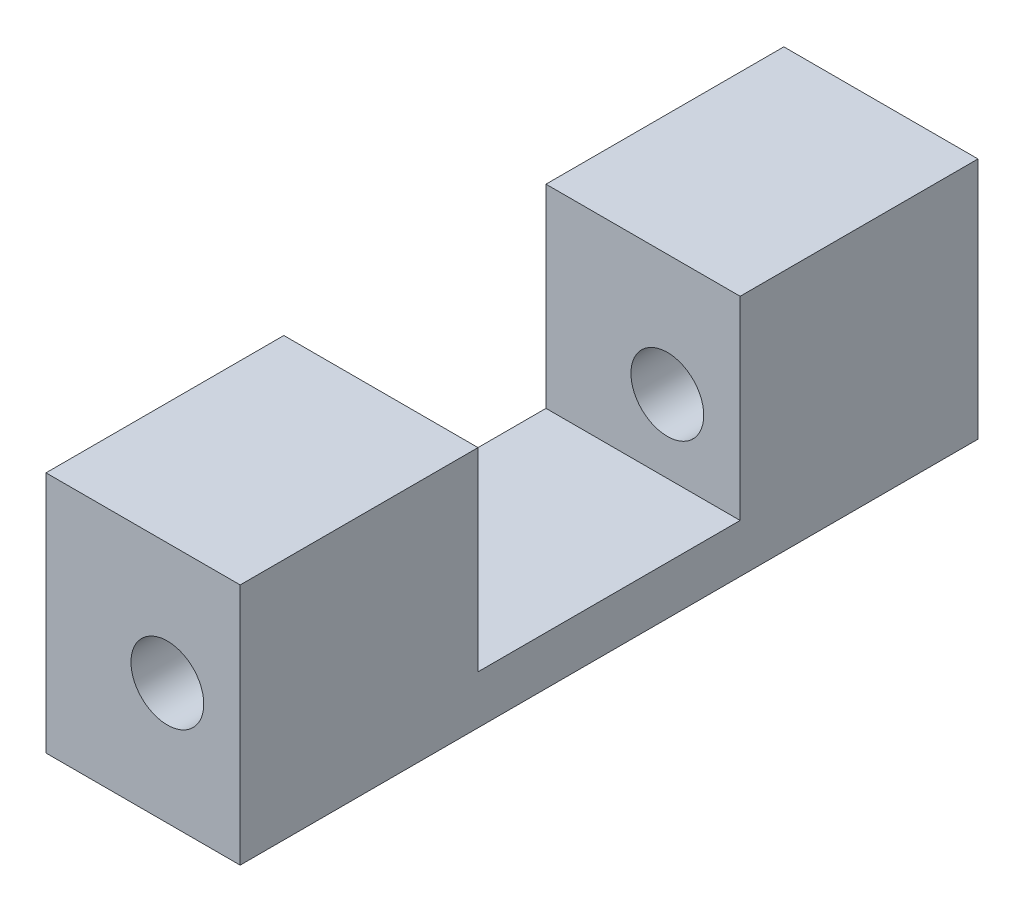
ISO-10303-21;
HEADER;
FILE_DESCRIPTION(('STEP AP214'),'2;1');
FILE_NAME('part.step','',(''),(''),'','','');
FILE_SCHEMA(('AUTOMOTIVE_DESIGN { 1 0 10303 214 1 1 1 1 }'));
ENDSEC;
DATA;
#1=APPLICATION_CONTEXT('core data for automotive mechanical design processes');
#2=APPLICATION_PROTOCOL_DEFINITION('international standard','automotive_design',2000,#1);
#3=PRODUCT_CONTEXT('',#1,'mechanical');
#4=PRODUCT('Part','Part','',(#3));
#5=PRODUCT_RELATED_PRODUCT_CATEGORY('part','',(#4));
#6=PRODUCT_DEFINITION_FORMATION('','',#4);
#7=PRODUCT_DEFINITION_CONTEXT('part definition',#1,'design');
#8=PRODUCT_DEFINITION('design','',#6,#7);
#9=PRODUCT_DEFINITION_SHAPE('','',#8);
#10=(LENGTH_UNIT() NAMED_UNIT(*) SI_UNIT(.MILLI.,.METRE.));
#11=(NAMED_UNIT(*) PLANE_ANGLE_UNIT() SI_UNIT($,.RADIAN.));
#12=(NAMED_UNIT(*) SI_UNIT($,.STERADIAN.) SOLID_ANGLE_UNIT());
#13=UNCERTAINTY_MEASURE_WITH_UNIT(LENGTH_MEASURE(1.E-05),#10,'distance_accuracy_value','');
#14=(GEOMETRIC_REPRESENTATION_CONTEXT(3) GLOBAL_UNCERTAINTY_ASSIGNED_CONTEXT((#13)) GLOBAL_UNIT_ASSIGNED_CONTEXT((#10,
#11,#12)) REPRESENTATION_CONTEXT('',''));
#15=CARTESIAN_POINT('',(0.,0.,0.));
#16=DIRECTION('',(0.,0.,1.));
#17=DIRECTION('',(1.,0.,0.));
#18=AXIS2_PLACEMENT_3D('',#15,#16,#17);
#19=CARTESIAN_POINT('',(-2.,1.,-7.6));
#20=DIRECTION('',(0.,0.,1.));
#21=DIRECTION('',(1.,0.,0.));
#22=AXIS2_PLACEMENT_3D('',#19,#20,#21);
#23=PLANE('',#22);
#24=DIRECTION('',(-1.,0.,0.));
#25=VECTOR('',#24,1.);
#26=CARTESIAN_POINT('',(-2.,0.,-7.6));
#27=LINE('',#26,#25);
#28=CARTESIAN_POINT('',(2.,0.,-7.6));
#29=VERTEX_POINT('',#28);
#30=CARTESIAN_POINT('',(-2.,0.,-7.6));
#31=VERTEX_POINT('',#30);
#32=EDGE_CURVE('E171',#29,#31,#27,.T.);
#33=ORIENTED_EDGE('',*,*,#32,.T.);
#34=DIRECTION('',(0.,-1.,0.));
#35=VECTOR('',#34,1.);
#36=CARTESIAN_POINT('',(-2.,1.,-7.6));
#37=LINE('',#36,#35);
#38=CARTESIAN_POINT('',(-2.,5.,-7.6));
#39=VERTEX_POINT('',#38);
#40=EDGE_CURVE('E47',#39,#31,#37,.T.);
#41=ORIENTED_EDGE('',*,*,#40,.F.);
#42=DIRECTION('',(1.,0.,0.));
#43=VECTOR('',#42,1.);
#44=CARTESIAN_POINT('',(-2.,5.,-7.6));
#45=LINE('',#44,#43);
#46=CARTESIAN_POINT('',(2.,5.,-7.6));
#47=VERTEX_POINT('',#46);
#48=EDGE_CURVE('E124',#39,#47,#45,.T.);
#49=ORIENTED_EDGE('',*,*,#48,.T.);
#50=DIRECTION('',(0.,-1.,0.));
#51=VECTOR('',#50,1.);
#52=CARTESIAN_POINT('',(2.,1.,-7.6));
#53=LINE('',#52,#51);
#54=EDGE_CURVE('E11',#47,#29,#53,.T.);
#55=ORIENTED_EDGE('',*,*,#54,.T.);
#56=EDGE_LOOP('',(#33,#41,#49,#55));
#57=FACE_BOUND('',#56,.T.);
#58=CARTESIAN_POINT('',(0.5,2.5,-7.6));
#59=DIRECTION('',(0.,0.,1.));
#60=DIRECTION('',(1.,0.,0.));
#61=AXIS2_PLACEMENT_3D('',#58,#59,#60);
#62=CIRCLE('',#61,0.750000000000001);
#63=CARTESIAN_POINT('',(1.25,2.5,-7.6));
#64=VERTEX_POINT('',#63);
#65=EDGE_CURVE('E328',#64,#64,#62,.T.);
#66=ORIENTED_EDGE('',*,*,#65,.T.);
#67=EDGE_LOOP('',(#66));
#68=FACE_BOUND('',#67,.T.);
#69=ADVANCED_FACE('F37',(#57,#68),#23,.F.);
#70=CARTESIAN_POINT('',(-2.,5.,-2.7));
#71=DIRECTION('',(0.,0.,1.));
#72=DIRECTION('',(1.,0.,0.));
#73=AXIS2_PLACEMENT_3D('',#70,#71,#72);
#74=PLANE('',#73);
#75=DIRECTION('',(-1.,0.,0.));
#76=VECTOR('',#75,1.);
#77=CARTESIAN_POINT('',(-2.,1.,-2.7));
#78=LINE('',#77,#76);
#79=CARTESIAN_POINT('',(2.,1.,-2.7));
#80=VERTEX_POINT('',#79);
#81=CARTESIAN_POINT('',(-2.,1.,-2.7));
#82=VERTEX_POINT('',#81);
#83=EDGE_CURVE('E125',#80,#82,#78,.T.);
#84=ORIENTED_EDGE('',*,*,#83,.F.);
#85=DIRECTION('',(0.,-1.,0.));
#86=VECTOR('',#85,1.);
#87=CARTESIAN_POINT('',(2.,5.,-2.7));
#88=LINE('',#87,#86);
#89=CARTESIAN_POINT('',(2.,5.,-2.7));
#90=VERTEX_POINT('',#89);
#91=EDGE_CURVE('E115',#90,#80,#88,.T.);
#92=ORIENTED_EDGE('',*,*,#91,.F.);
#93=DIRECTION('',(-1.,0.,0.));
#94=VECTOR('',#93,1.);
#95=CARTESIAN_POINT('',(-2.,5.,-2.7));
#96=LINE('',#95,#94);
#97=CARTESIAN_POINT('',(-2.,5.,-2.7));
#98=VERTEX_POINT('',#97);
#99=EDGE_CURVE('E121',#90,#98,#96,.T.);
#100=ORIENTED_EDGE('',*,*,#99,.T.);
#101=DIRECTION('',(0.,-1.,0.));
#102=VECTOR('',#101,1.);
#103=CARTESIAN_POINT('',(-2.,5.,-2.7));
#104=LINE('',#103,#102);
#105=EDGE_CURVE('E104',#98,#82,#104,.T.);
#106=ORIENTED_EDGE('',*,*,#105,.T.);
#107=EDGE_LOOP('',(#84,#92,#100,#106));
#108=FACE_BOUND('',#107,.T.);
#109=CARTESIAN_POINT('',(0.5,2.5,-2.7));
#110=DIRECTION('',(0.,0.,1.));
#111=DIRECTION('',(1.,0.,0.));
#112=AXIS2_PLACEMENT_3D('',#109,#110,#111);
#113=CIRCLE('',#112,0.750000000000001);
#114=CARTESIAN_POINT('',(1.25,2.5,-2.7));
#115=VERTEX_POINT('',#114);
#116=EDGE_CURVE('E136',#115,#115,#113,.T.);
#117=ORIENTED_EDGE('',*,*,#116,.F.);
#118=EDGE_LOOP('',(#117));
#119=FACE_BOUND('',#118,.T.);
#120=ADVANCED_FACE('F127',(#108,#119),#74,.T.);
#121=CARTESIAN_POINT('',(0.,1.,0.));
#122=DIRECTION('',(0.,-1.,0.));
#123=DIRECTION('',(0.,0.,-1.));
#124=AXIS2_PLACEMENT_3D('',#121,#122,#123);
#125=PLANE('',#124);
#126=DIRECTION('',(0.,0.,-1.));
#127=VECTOR('',#126,1.);
#128=CARTESIAN_POINT('',(2.,1.,7.6));
#129=LINE('',#128,#127);
#130=CARTESIAN_POINT('',(2.,1.,2.7));
#131=VERTEX_POINT('',#130);
#132=EDGE_CURVE('E55',#131,#80,#129,.T.);
#133=ORIENTED_EDGE('',*,*,#132,.T.);
#134=ORIENTED_EDGE('',*,*,#83,.T.);
#135=DIRECTION('',(0.,0.,1.));
#136=VECTOR('',#135,1.);
#137=CARTESIAN_POINT('',(-2.,1.,7.6));
#138=LINE('',#137,#136);
#139=CARTESIAN_POINT('',(-2.,1.,2.7));
#140=VERTEX_POINT('',#139);
#141=EDGE_CURVE('E41',#82,#140,#138,.T.);
#142=ORIENTED_EDGE('',*,*,#141,.T.);
#143=DIRECTION('',(-1.,0.,0.));
#144=VECTOR('',#143,1.);
#145=CARTESIAN_POINT('',(-2.,1.,2.7));
#146=LINE('',#145,#144);
#147=EDGE_CURVE('E60',#131,#140,#146,.T.);
#148=ORIENTED_EDGE('',*,*,#147,.F.);
#149=EDGE_LOOP('',(#133,#134,#142,#148));
#150=FACE_BOUND('',#149,.T.);
#151=ADVANCED_FACE('F218',(#150),#125,.F.);
#152=CARTESIAN_POINT('',(2.,1.,7.6));
#153=DIRECTION('',(-1.,0.,0.));
#154=DIRECTION('',(0.,0.,1.));
#155=AXIS2_PLACEMENT_3D('',#152,#153,#154);
#156=PLANE('',#155);
#157=DIRECTION('',(0.,0.,-1.));
#158=VECTOR('',#157,1.);
#159=CARTESIAN_POINT('',(2.,0.,7.6));
#160=LINE('',#159,#158);
#161=CARTESIAN_POINT('',(2.,0.,7.6));
#162=VERTEX_POINT('',#161);
#163=EDGE_CURVE('E165',#162,#29,#160,.T.);
#164=ORIENTED_EDGE('',*,*,#163,.T.);
#165=ORIENTED_EDGE('',*,*,#54,.F.);
#166=DIRECTION('',(0.,0.,1.));
#167=VECTOR('',#166,1.);
#168=CARTESIAN_POINT('',(2.,5.,-7.6));
#169=LINE('',#168,#167);
#170=EDGE_CURVE('E129',#47,#90,#169,.T.);
#171=ORIENTED_EDGE('',*,*,#170,.T.);
#172=ORIENTED_EDGE('',*,*,#91,.T.);
#173=ORIENTED_EDGE('',*,*,#132,.F.);
#174=DIRECTION('',(0.,-1.,0.));
#175=VECTOR('',#174,1.);
#176=CARTESIAN_POINT('',(2.,5.,2.7));
#177=LINE('',#176,#175);
#178=CARTESIAN_POINT('',(2.,5.,2.7));
#179=VERTEX_POINT('',#178);
#180=EDGE_CURVE('E161',#179,#131,#177,.T.);
#181=ORIENTED_EDGE('',*,*,#180,.F.);
#182=DIRECTION('',(0.,0.,-1.));
#183=VECTOR('',#182,1.);
#184=CARTESIAN_POINT('',(2.,5.,7.6));
#185=LINE('',#184,#183);
#186=CARTESIAN_POINT('',(2.,5.,7.6));
#187=VERTEX_POINT('',#186);
#188=EDGE_CURVE('E149',#187,#179,#185,.T.);
#189=ORIENTED_EDGE('',*,*,#188,.F.);
#190=DIRECTION('',(0.,-1.,0.));
#191=VECTOR('',#190,1.);
#192=CARTESIAN_POINT('',(2.,1.,7.6));
#193=LINE('',#192,#191);
#194=EDGE_CURVE('E183',#187,#162,#193,.T.);
#195=ORIENTED_EDGE('',*,*,#194,.T.);
#196=EDGE_LOOP('',(#164,#165,#171,#172,#173,#181,#189,#195));
#197=FACE_BOUND('',#196,.T.);
#198=ADVANCED_FACE('F39',(#197),#156,.F.);
#199=CARTESIAN_POINT('',(-2.,1.,7.6));
#200=DIRECTION('',(1.,0.,0.));
#201=DIRECTION('',(0.,0.,-1.));
#202=AXIS2_PLACEMENT_3D('',#199,#200,#201);
#203=PLANE('',#202);
#204=DIRECTION('',(0.,0.,1.));
#205=VECTOR('',#204,1.);
#206=CARTESIAN_POINT('',(-2.,0.,7.6));
#207=LINE('',#206,#205);
#208=CARTESIAN_POINT('',(-2.,0.,7.6));
#209=VERTEX_POINT('',#208);
#210=EDGE_CURVE('E176',#31,#209,#207,.T.);
#211=ORIENTED_EDGE('',*,*,#210,.T.);
#212=DIRECTION('',(0.,-1.,0.));
#213=VECTOR('',#212,1.);
#214=CARTESIAN_POINT('',(-2.,1.,7.6));
#215=LINE('',#214,#213);
#216=CARTESIAN_POINT('',(-2.,5.,7.6));
#217=VERTEX_POINT('',#216);
#218=EDGE_CURVE('E185',#217,#209,#215,.T.);
#219=ORIENTED_EDGE('',*,*,#218,.F.);
#220=DIRECTION('',(0.,0.,1.));
#221=VECTOR('',#220,1.);
#222=CARTESIAN_POINT('',(-2.,5.,7.6));
#223=LINE('',#222,#221);
#224=CARTESIAN_POINT('',(-2.,5.,2.7));
#225=VERTEX_POINT('',#224);
#226=EDGE_CURVE('E143',#225,#217,#223,.T.);
#227=ORIENTED_EDGE('',*,*,#226,.F.);
#228=DIRECTION('',(0.,-1.,0.));
#229=VECTOR('',#228,1.);
#230=CARTESIAN_POINT('',(-2.,5.,2.7));
#231=LINE('',#230,#229);
#232=EDGE_CURVE('E153',#225,#140,#231,.T.);
#233=ORIENTED_EDGE('',*,*,#232,.T.);
#234=ORIENTED_EDGE('',*,*,#141,.F.);
#235=ORIENTED_EDGE('',*,*,#105,.F.);
#236=DIRECTION('',(0.,0.,-1.));
#237=VECTOR('',#236,1.);
#238=CARTESIAN_POINT('',(-2.,5.,-7.6));
#239=LINE('',#238,#237);
#240=EDGE_CURVE('E108',#98,#39,#239,.T.);
#241=ORIENTED_EDGE('',*,*,#240,.T.);
#242=ORIENTED_EDGE('',*,*,#40,.T.);
#243=EDGE_LOOP('',(#211,#219,#227,#233,#234,#235,#241,#242));
#244=FACE_BOUND('',#243,.T.);
#245=ADVANCED_FACE('F106',(#244),#203,.F.);
#246=CARTESIAN_POINT('',(-2.,1.,7.6));
#247=DIRECTION('',(0.,0.,-1.));
#248=DIRECTION('',(-1.,0.,0.));
#249=AXIS2_PLACEMENT_3D('',#246,#247,#248);
#250=PLANE('',#249);
#251=CARTESIAN_POINT('',(0.5,2.5,7.6));
#252=DIRECTION('',(0.,0.,1.));
#253=DIRECTION('',(1.,0.,0.));
#254=AXIS2_PLACEMENT_3D('',#251,#252,#253);
#255=CIRCLE('',#254,0.750000000000001);
#256=CARTESIAN_POINT('',(1.25,2.5,7.6));
#257=VERTEX_POINT('',#256);
#258=EDGE_CURVE('E114',#257,#257,#255,.T.);
#259=ORIENTED_EDGE('',*,*,#258,.F.);
#260=EDGE_LOOP('',(#259));
#261=FACE_BOUND('',#260,.T.);
#262=DIRECTION('',(1.,0.,0.));
#263=VECTOR('',#262,1.);
#264=CARTESIAN_POINT('',(-2.,0.,7.6));
#265=LINE('',#264,#263);
#266=EDGE_CURVE('E181',#209,#162,#265,.T.);
#267=ORIENTED_EDGE('',*,*,#266,.T.);
#268=ORIENTED_EDGE('',*,*,#194,.F.);
#269=DIRECTION('',(1.,0.,0.));
#270=VECTOR('',#269,1.);
#271=CARTESIAN_POINT('',(-2.,5.,7.6));
#272=LINE('',#271,#270);
#273=EDGE_CURVE('E146',#217,#187,#272,.T.);
#274=ORIENTED_EDGE('',*,*,#273,.F.);
#275=ORIENTED_EDGE('',*,*,#218,.T.);
#276=EDGE_LOOP('',(#267,#268,#274,#275));
#277=FACE_BOUND('',#276,.T.);
#278=ADVANCED_FACE('F194',(#261,#277),#250,.F.);
#279=CARTESIAN_POINT('',(0.,0.,0.));
#280=DIRECTION('',(0.,-1.,0.));
#281=DIRECTION('',(0.,0.,-1.));
#282=AXIS2_PLACEMENT_3D('',#279,#280,#281);
#283=PLANE('',#282);
#284=ORIENTED_EDGE('',*,*,#163,.F.);
#285=ORIENTED_EDGE('',*,*,#266,.F.);
#286=ORIENTED_EDGE('',*,*,#210,.F.);
#287=ORIENTED_EDGE('',*,*,#32,.F.);
#288=EDGE_LOOP('',(#284,#285,#286,#287));
#289=FACE_BOUND('',#288,.T.);
#290=ADVANCED_FACE('F192',(#289),#283,.T.);
#291=CARTESIAN_POINT('',(-2.,5.,2.7));
#292=DIRECTION('',(0.,0.,1.));
#293=DIRECTION('',(1.,0.,0.));
#294=AXIS2_PLACEMENT_3D('',#291,#292,#293);
#295=PLANE('',#294);
#296=CARTESIAN_POINT('',(0.5,2.5,2.7));
#297=DIRECTION('',(0.,0.,1.));
#298=DIRECTION('',(1.,0.,0.));
#299=AXIS2_PLACEMENT_3D('',#296,#297,#298);
#300=CIRCLE('',#299,0.750000000000001);
#301=CARTESIAN_POINT('',(1.25,2.5,2.7));
#302=VERTEX_POINT('',#301);
#303=EDGE_CURVE('E140',#302,#302,#300,.F.);
#304=ORIENTED_EDGE('',*,*,#303,.F.);
#305=EDGE_LOOP('',(#304));
#306=FACE_BOUND('',#305,.T.);
#307=ORIENTED_EDGE('',*,*,#147,.T.);
#308=ORIENTED_EDGE('',*,*,#232,.F.);
#309=DIRECTION('',(-1.,0.,0.));
#310=VECTOR('',#309,1.);
#311=CARTESIAN_POINT('',(-2.,5.,2.7));
#312=LINE('',#311,#310);
#313=EDGE_CURVE('E151',#179,#225,#312,.T.);
#314=ORIENTED_EDGE('',*,*,#313,.F.);
#315=ORIENTED_EDGE('',*,*,#180,.T.);
#316=EDGE_LOOP('',(#307,#308,#314,#315));
#317=FACE_BOUND('',#316,.T.);
#318=ADVANCED_FACE('F201',(#306,#317),#295,.F.);
#319=CARTESIAN_POINT('',(0.,5.,0.));
#320=DIRECTION('',(0.,-1.,0.));
#321=DIRECTION('',(0.,0.,-1.));
#322=AXIS2_PLACEMENT_3D('',#319,#320,#321);
#323=PLANE('',#322);
#324=ORIENTED_EDGE('',*,*,#226,.T.);
#325=ORIENTED_EDGE('',*,*,#273,.T.);
#326=ORIENTED_EDGE('',*,*,#188,.T.);
#327=ORIENTED_EDGE('',*,*,#313,.T.);
#328=EDGE_LOOP('',(#324,#325,#326,#327));
#329=FACE_BOUND('',#328,.T.);
#330=ADVANCED_FACE('F198',(#329),#323,.F.);
#331=CARTESIAN_POINT('',(0.5,2.5,-7.601025));
#332=DIRECTION('',(0.,0.,1.));
#333=DIRECTION('',(1.,0.,0.));
#334=AXIS2_PLACEMENT_3D('',#331,#332,#333);
#335=CYLINDRICAL_SURFACE('',#334,0.750000000000001);
#336=ORIENTED_EDGE('',*,*,#258,.T.);
#337=EDGE_LOOP('',(#336));
#338=FACE_BOUND('',#337,.T.);
#339=ORIENTED_EDGE('',*,*,#303,.T.);
#340=EDGE_LOOP('',(#339));
#341=FACE_BOUND('',#340,.T.);
#342=ADVANCED_FACE('F209',(#338,#341),#335,.F.);
#343=CARTESIAN_POINT('',(0.,5.,0.));
#344=DIRECTION('',(0.,-1.,0.));
#345=DIRECTION('',(0.,0.,1.));
#346=AXIS2_PLACEMENT_3D('',#343,#344,#345);
#347=PLANE('',#346);
#348=ORIENTED_EDGE('',*,*,#240,.F.);
#349=ORIENTED_EDGE('',*,*,#99,.F.);
#350=ORIENTED_EDGE('',*,*,#170,.F.);
#351=ORIENTED_EDGE('',*,*,#48,.F.);
#352=EDGE_LOOP('',(#348,#349,#350,#351));
#353=FACE_BOUND('',#352,.T.);
#354=ADVANCED_FACE('F119',(#353),#347,.F.);
#355=CARTESIAN_POINT('',(0.5,2.5,7.601));
#356=DIRECTION('',(0.,0.,-1.));
#357=DIRECTION('',(-1.,0.,0.));
#358=AXIS2_PLACEMENT_3D('',#355,#356,#357);
#359=CYLINDRICAL_SURFACE('',#358,0.750000000000001);
#360=ORIENTED_EDGE('',*,*,#116,.T.);
#361=EDGE_LOOP('',(#360));
#362=FACE_BOUND('',#361,.T.);
#363=ORIENTED_EDGE('',*,*,#65,.F.);
#364=EDGE_LOOP('',(#363));
#365=FACE_BOUND('',#364,.T.);
#366=ADVANCED_FACE('F268',(#362,#365),#359,.F.);
#367=CLOSED_SHELL('',(#69,#120,#151,#198,#245,#278,#290,#318,#330,#342,#354,#366));
#368=MANIFOLD_SOLID_BREP('B2',#367);
#369=ADVANCED_BREP_SHAPE_REPRESENTATION('',(#18,#368),#14);
#370=SHAPE_DEFINITION_REPRESENTATION(#9,#369);
ENDSEC;
END-ISO-10303-21;
